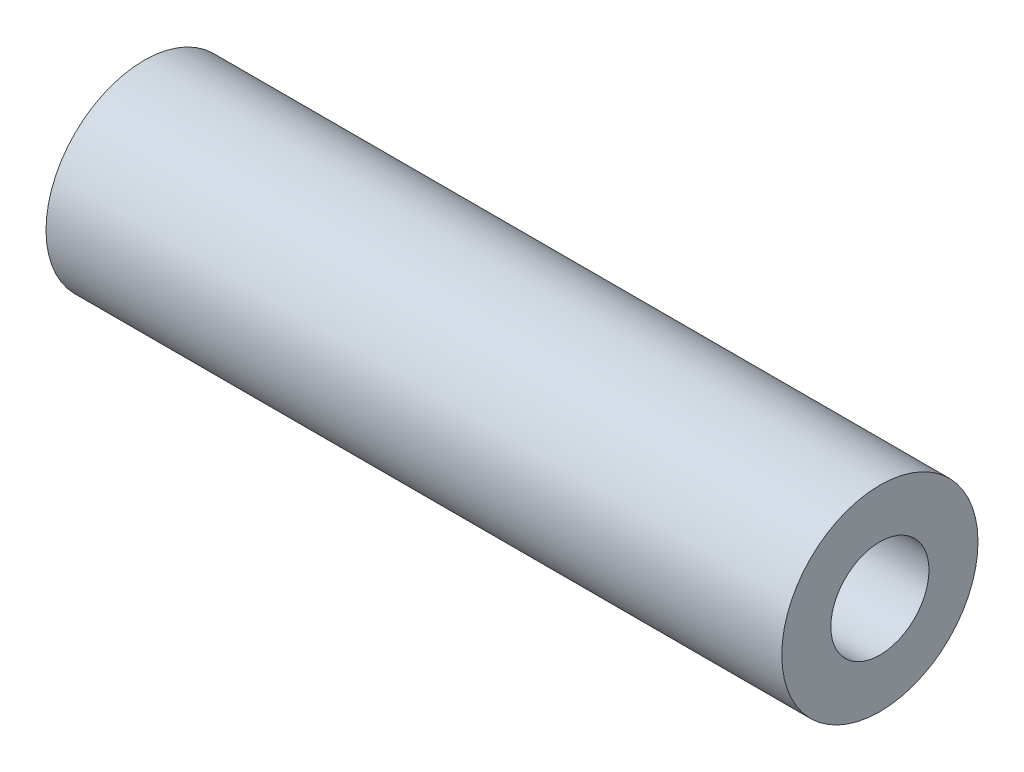
ISO-10303-21;
HEADER;
FILE_DESCRIPTION(('STEP AP214'),'2;1');
FILE_NAME('part.step','',(''),(''),'','','');
FILE_SCHEMA(('AUTOMOTIVE_DESIGN { 1 0 10303 214 1 1 1 1 }'));
ENDSEC;
DATA;
#1=APPLICATION_CONTEXT('core data for automotive mechanical design processes');
#2=APPLICATION_PROTOCOL_DEFINITION('international standard','automotive_design',2000,#1);
#3=PRODUCT_CONTEXT('',#1,'mechanical');
#4=PRODUCT('Part','Part','',(#3));
#5=PRODUCT_RELATED_PRODUCT_CATEGORY('part','',(#4));
#6=PRODUCT_DEFINITION_FORMATION('','',#4);
#7=PRODUCT_DEFINITION_CONTEXT('part definition',#1,'design');
#8=PRODUCT_DEFINITION('design','',#6,#7);
#9=PRODUCT_DEFINITION_SHAPE('','',#8);
#10=(LENGTH_UNIT() NAMED_UNIT(*) SI_UNIT(.MILLI.,.METRE.));
#11=(NAMED_UNIT(*) PLANE_ANGLE_UNIT() SI_UNIT($,.RADIAN.));
#12=(NAMED_UNIT(*) SI_UNIT($,.STERADIAN.) SOLID_ANGLE_UNIT());
#13=UNCERTAINTY_MEASURE_WITH_UNIT(LENGTH_MEASURE(1.E-05),#10,'distance_accuracy_value','');
#14=(GEOMETRIC_REPRESENTATION_CONTEXT(3) GLOBAL_UNCERTAINTY_ASSIGNED_CONTEXT((#13)) GLOBAL_UNIT_ASSIGNED_CONTEXT((#10,
#11,#12)) REPRESENTATION_CONTEXT('',''));
#15=CARTESIAN_POINT('',(0.,0.,0.));
#16=DIRECTION('',(0.,0.,1.));
#17=DIRECTION('',(1.,0.,0.));
#18=AXIS2_PLACEMENT_3D('',#15,#16,#17);
#19=CARTESIAN_POINT('',(47.625,0.,0.));
#20=DIRECTION('',(1.,0.,0.));
#21=DIRECTION('',(0.,0.,1.));
#22=AXIS2_PLACEMENT_3D('',#19,#20,#21);
#23=PLANE('',#22);
#24=CARTESIAN_POINT('',(47.625,0.,0.));
#25=DIRECTION('',(-1.,0.,0.));
#26=DIRECTION('',(0.,0.,1.));
#27=AXIS2_PLACEMENT_3D('',#24,#25,#26);
#28=CIRCLE('',#27,6.35);
#29=CARTESIAN_POINT('',(47.625,0.,6.35));
#30=VERTEX_POINT('',#29);
#31=EDGE_CURVE('E10',#30,#30,#28,.T.);
#32=ORIENTED_EDGE('',*,*,#31,.F.);
#33=EDGE_LOOP('',(#32));
#34=FACE_BOUND('',#33,.T.);
#35=CARTESIAN_POINT('',(47.625,0.,0.));
#36=DIRECTION('',(-1.,0.,0.));
#37=DIRECTION('',(0.,0.,1.));
#38=AXIS2_PLACEMENT_3D('',#35,#36,#37);
#39=CIRCLE('',#38,3.175);
#40=CARTESIAN_POINT('',(47.625,0.,3.175));
#41=VERTEX_POINT('',#40);
#42=EDGE_CURVE('E46',#41,#41,#39,.T.);
#43=ORIENTED_EDGE('',*,*,#42,.T.);
#44=EDGE_LOOP('',(#43));
#45=FACE_BOUND('',#44,.T.);
#46=ADVANCED_FACE('F35',(#34,#45),#23,.T.);
#47=CARTESIAN_POINT('',(0.,0.,0.));
#48=DIRECTION('',(1.,0.,0.));
#49=DIRECTION('',(0.,0.,1.));
#50=AXIS2_PLACEMENT_3D('',#47,#48,#49);
#51=PLANE('',#50);
#52=CARTESIAN_POINT('',(0.,0.,0.));
#53=DIRECTION('',(-1.,0.,0.));
#54=DIRECTION('',(0.,0.,1.));
#55=AXIS2_PLACEMENT_3D('',#52,#53,#54);
#56=CIRCLE('',#55,6.35);
#57=CARTESIAN_POINT('',(0.,0.,6.35));
#58=VERTEX_POINT('',#57);
#59=EDGE_CURVE('E39',#58,#58,#56,.T.);
#60=ORIENTED_EDGE('',*,*,#59,.T.);
#61=EDGE_LOOP('',(#60));
#62=FACE_BOUND('',#61,.T.);
#63=CARTESIAN_POINT('',(0.,0.,0.));
#64=DIRECTION('',(-1.,0.,0.));
#65=DIRECTION('',(0.,0.,1.));
#66=AXIS2_PLACEMENT_3D('',#63,#64,#65);
#67=CIRCLE('',#66,3.175);
#68=CARTESIAN_POINT('',(0.,0.,3.175));
#69=VERTEX_POINT('',#68);
#70=EDGE_CURVE('E48',#69,#69,#67,.T.);
#71=ORIENTED_EDGE('',*,*,#70,.F.);
#72=EDGE_LOOP('',(#71));
#73=FACE_BOUND('',#72,.T.);
#74=ADVANCED_FACE('F61',(#62,#73),#51,.F.);
#75=CARTESIAN_POINT('',(47.625,0.,0.));
#76=DIRECTION('',(-1.,0.,0.));
#77=DIRECTION('',(0.,0.,-1.));
#78=AXIS2_PLACEMENT_3D('',#75,#76,#77);
#79=CYLINDRICAL_SURFACE('',#78,6.35);
#80=ORIENTED_EDGE('',*,*,#31,.T.);
#81=EDGE_LOOP('',(#80));
#82=FACE_BOUND('',#81,.T.);
#83=ORIENTED_EDGE('',*,*,#59,.F.);
#84=EDGE_LOOP('',(#83));
#85=FACE_BOUND('',#84,.T.);
#86=ADVANCED_FACE('F37',(#82,#85),#79,.T.);
#87=CARTESIAN_POINT('',(47.625,0.,0.));
#88=DIRECTION('',(-1.,0.,0.));
#89=DIRECTION('',(0.,0.,-1.));
#90=AXIS2_PLACEMENT_3D('',#87,#88,#89);
#91=CYLINDRICAL_SURFACE('',#90,3.175);
#92=ORIENTED_EDGE('',*,*,#42,.F.);
#93=EDGE_LOOP('',(#92));
#94=FACE_BOUND('',#93,.T.);
#95=ORIENTED_EDGE('',*,*,#70,.T.);
#96=EDGE_LOOP('',(#95));
#97=FACE_BOUND('',#96,.T.);
#98=ADVANCED_FACE('F55',(#94,#97),#91,.F.);
#99=CLOSED_SHELL('',(#46,#74,#86,#98));
#100=MANIFOLD_SOLID_BREP('B2',#99);
#101=ADVANCED_BREP_SHAPE_REPRESENTATION('',(#18,#100),#14);
#102=SHAPE_DEFINITION_REPRESENTATION(#9,#101);
ENDSEC;
END-ISO-10303-21;
